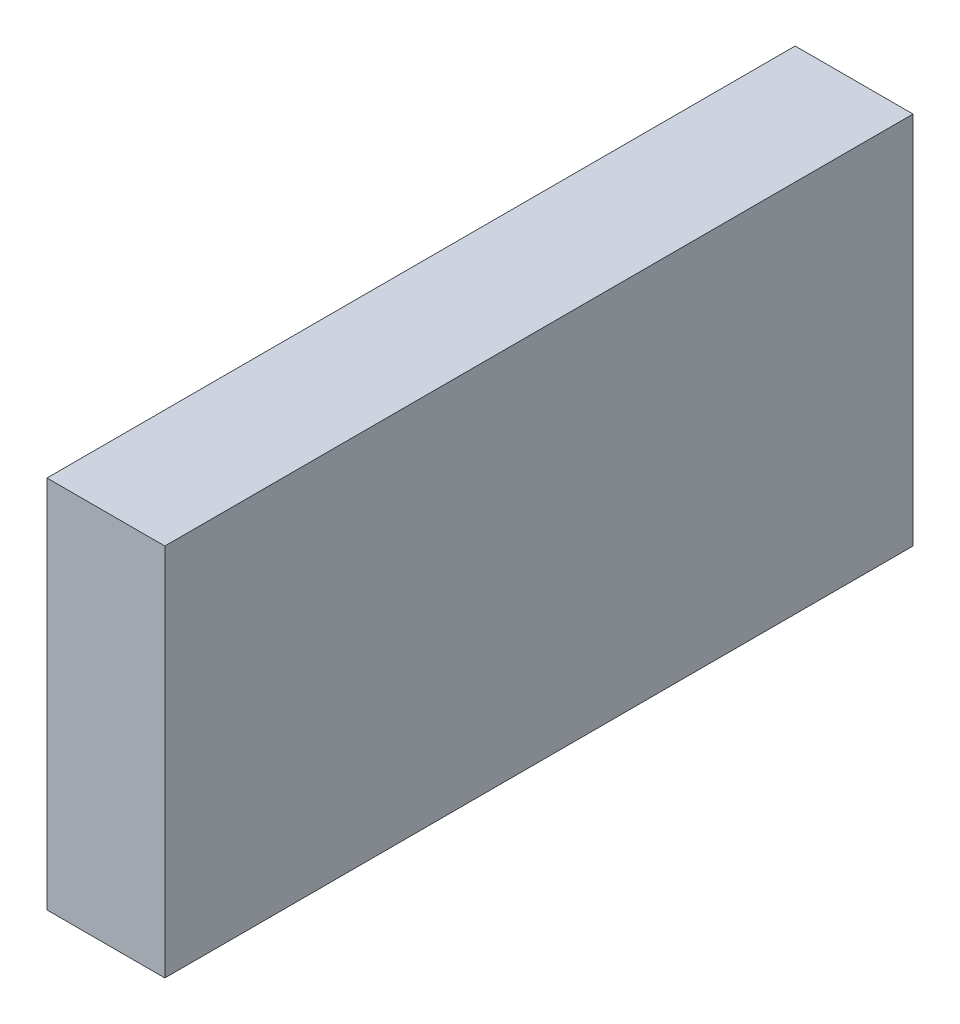
ISO-10303-21;
HEADER;
FILE_DESCRIPTION(('STEP AP214'),'2;1');
FILE_NAME('part.step','',(''),(''),'','','');
FILE_SCHEMA(('AUTOMOTIVE_DESIGN { 1 0 10303 214 1 1 1 1 }'));
ENDSEC;
DATA;
#1=APPLICATION_CONTEXT('core data for automotive mechanical design processes');
#2=APPLICATION_PROTOCOL_DEFINITION('international standard','automotive_design',2000,#1);
#3=PRODUCT_CONTEXT('',#1,'mechanical');
#4=PRODUCT('Part','Part','',(#3));
#5=PRODUCT_RELATED_PRODUCT_CATEGORY('part','',(#4));
#6=PRODUCT_DEFINITION_FORMATION('','',#4);
#7=PRODUCT_DEFINITION_CONTEXT('part definition',#1,'design');
#8=PRODUCT_DEFINITION('design','',#6,#7);
#9=PRODUCT_DEFINITION_SHAPE('','',#8);
#10=(LENGTH_UNIT() NAMED_UNIT(*) SI_UNIT(.MILLI.,.METRE.));
#11=(NAMED_UNIT(*) PLANE_ANGLE_UNIT() SI_UNIT($,.RADIAN.));
#12=(NAMED_UNIT(*) SI_UNIT($,.STERADIAN.) SOLID_ANGLE_UNIT());
#13=UNCERTAINTY_MEASURE_WITH_UNIT(LENGTH_MEASURE(1.E-05),#10,'distance_accuracy_value','');
#14=(GEOMETRIC_REPRESENTATION_CONTEXT(3) GLOBAL_UNCERTAINTY_ASSIGNED_CONTEXT((#13)) GLOBAL_UNIT_ASSIGNED_CONTEXT((#10,
#11,#12)) REPRESENTATION_CONTEXT('',''));
#15=CARTESIAN_POINT('',(0.,0.,0.));
#16=DIRECTION('',(0.,0.,1.));
#17=DIRECTION('',(1.,0.,0.));
#18=AXIS2_PLACEMENT_3D('',#15,#16,#17);
#19=CARTESIAN_POINT('',(-6.3,0.,0.));
#20=DIRECTION('',(0.,0.,1.));
#21=DIRECTION('',(1.,0.,0.));
#22=AXIS2_PLACEMENT_3D('',#19,#20,#21);
#23=PLANE('',#22);
#24=DIRECTION('',(0.,-1.,0.));
#25=VECTOR('',#24,1.);
#26=CARTESIAN_POINT('',(0.,0.,0.));
#27=LINE('',#26,#25);
#28=CARTESIAN_POINT('',(0.,20.,0.));
#29=VERTEX_POINT('',#28);
#30=CARTESIAN_POINT('',(0.,0.,0.));
#31=VERTEX_POINT('',#30);
#32=EDGE_CURVE('E107',#29,#31,#27,.T.);
#33=ORIENTED_EDGE('',*,*,#32,.F.);
#34=DIRECTION('',(1.,0.,0.));
#35=VECTOR('',#34,1.);
#36=CARTESIAN_POINT('',(-6.3,20.,0.));
#37=LINE('',#36,#35);
#38=CARTESIAN_POINT('',(-6.3,20.,0.));
#39=VERTEX_POINT('',#38);
#40=EDGE_CURVE('E11',#39,#29,#37,.T.);
#41=ORIENTED_EDGE('',*,*,#40,.F.);
#42=DIRECTION('',(0.,-1.,0.));
#43=VECTOR('',#42,1.);
#44=CARTESIAN_POINT('',(-6.3,0.,0.));
#45=LINE('',#44,#43);
#46=CARTESIAN_POINT('',(-6.3,0.,0.));
#47=VERTEX_POINT('',#46);
#48=EDGE_CURVE('E102',#39,#47,#45,.T.);
#49=ORIENTED_EDGE('',*,*,#48,.T.);
#50=DIRECTION('',(1.,0.,0.));
#51=VECTOR('',#50,1.);
#52=CARTESIAN_POINT('',(-6.3,0.,0.));
#53=LINE('',#52,#51);
#54=EDGE_CURVE('E46',#47,#31,#53,.T.);
#55=ORIENTED_EDGE('',*,*,#54,.T.);
#56=EDGE_LOOP('',(#33,#41,#49,#55));
#57=FACE_BOUND('',#56,.T.);
#58=ADVANCED_FACE('F43',(#57),#23,.T.);
#59=CARTESIAN_POINT('',(-6.3,20.,0.));
#60=DIRECTION('',(0.,1.,0.));
#61=DIRECTION('',(0.,0.,1.));
#62=AXIS2_PLACEMENT_3D('',#59,#60,#61);
#63=PLANE('',#62);
#64=DIRECTION('',(0.,0.,1.));
#65=VECTOR('',#64,1.);
#66=CARTESIAN_POINT('',(0.,20.,0.));
#67=LINE('',#66,#65);
#68=CARTESIAN_POINT('',(0.,20.,-40.));
#69=VERTEX_POINT('',#68);
#70=EDGE_CURVE('E104',#69,#29,#67,.T.);
#71=ORIENTED_EDGE('',*,*,#70,.F.);
#72=DIRECTION('',(1.,0.,0.));
#73=VECTOR('',#72,1.);
#74=CARTESIAN_POINT('',(-6.3,20.,-40.));
#75=LINE('',#74,#73);
#76=CARTESIAN_POINT('',(-6.3,20.,-40.));
#77=VERTEX_POINT('',#76);
#78=EDGE_CURVE('E55',#77,#69,#75,.T.);
#79=ORIENTED_EDGE('',*,*,#78,.F.);
#80=DIRECTION('',(0.,0.,1.));
#81=VECTOR('',#80,1.);
#82=CARTESIAN_POINT('',(-6.3,20.,0.));
#83=LINE('',#82,#81);
#84=EDGE_CURVE('E97',#77,#39,#83,.T.);
#85=ORIENTED_EDGE('',*,*,#84,.T.);
#86=ORIENTED_EDGE('',*,*,#40,.T.);
#87=EDGE_LOOP('',(#71,#79,#85,#86));
#88=FACE_BOUND('',#87,.T.);
#89=ADVANCED_FACE('F117',(#88),#63,.T.);
#90=CARTESIAN_POINT('',(-6.3,0.,-40.));
#91=DIRECTION('',(0.,0.,-1.));
#92=DIRECTION('',(-1.,0.,0.));
#93=AXIS2_PLACEMENT_3D('',#90,#91,#92);
#94=PLANE('',#93);
#95=DIRECTION('',(0.,1.,0.));
#96=VECTOR('',#95,1.);
#97=CARTESIAN_POINT('',(0.,0.,-40.));
#98=LINE('',#97,#96);
#99=CARTESIAN_POINT('',(0.,0.,-40.));
#100=VERTEX_POINT('',#99);
#101=EDGE_CURVE('E93',#100,#69,#98,.T.);
#102=ORIENTED_EDGE('',*,*,#101,.F.);
#103=DIRECTION('',(1.,0.,0.));
#104=VECTOR('',#103,1.);
#105=CARTESIAN_POINT('',(-6.3,0.,-40.));
#106=LINE('',#105,#104);
#107=CARTESIAN_POINT('',(-6.3,0.,-40.));
#108=VERTEX_POINT('',#107);
#109=EDGE_CURVE('E88',#108,#100,#106,.T.);
#110=ORIENTED_EDGE('',*,*,#109,.F.);
#111=DIRECTION('',(0.,1.,0.));
#112=VECTOR('',#111,1.);
#113=CARTESIAN_POINT('',(-6.3,0.,-40.));
#114=LINE('',#113,#112);
#115=EDGE_CURVE('E91',#108,#77,#114,.T.);
#116=ORIENTED_EDGE('',*,*,#115,.T.);
#117=ORIENTED_EDGE('',*,*,#78,.T.);
#118=EDGE_LOOP('',(#102,#110,#116,#117));
#119=FACE_BOUND('',#118,.T.);
#120=ADVANCED_FACE('F89',(#119),#94,.T.);
#121=CARTESIAN_POINT('',(-6.3,0.,0.));
#122=DIRECTION('',(0.,-1.,0.));
#123=DIRECTION('',(0.,0.,-1.));
#124=AXIS2_PLACEMENT_3D('',#121,#122,#123);
#125=PLANE('',#124);
#126=DIRECTION('',(0.,0.,-1.));
#127=VECTOR('',#126,1.);
#128=CARTESIAN_POINT('',(0.,0.,0.));
#129=LINE('',#128,#127);
#130=EDGE_CURVE('E110',#31,#100,#129,.T.);
#131=ORIENTED_EDGE('',*,*,#130,.F.);
#132=ORIENTED_EDGE('',*,*,#54,.F.);
#133=DIRECTION('',(0.,0.,-1.));
#134=VECTOR('',#133,1.);
#135=CARTESIAN_POINT('',(-6.3,0.,0.));
#136=LINE('',#135,#134);
#137=EDGE_CURVE('E100',#47,#108,#136,.T.);
#138=ORIENTED_EDGE('',*,*,#137,.T.);
#139=ORIENTED_EDGE('',*,*,#109,.T.);
#140=EDGE_LOOP('',(#131,#132,#138,#139));
#141=FACE_BOUND('',#140,.T.);
#142=ADVANCED_FACE('F99',(#141),#125,.T.);
#143=CARTESIAN_POINT('',(-6.3,0.,0.));
#144=DIRECTION('',(-1.,0.,0.));
#145=DIRECTION('',(0.,0.,1.));
#146=AXIS2_PLACEMENT_3D('',#143,#144,#145);
#147=PLANE('',#146);
#148=ORIENTED_EDGE('',*,*,#48,.F.);
#149=ORIENTED_EDGE('',*,*,#84,.F.);
#150=ORIENTED_EDGE('',*,*,#115,.F.);
#151=ORIENTED_EDGE('',*,*,#137,.F.);
#152=EDGE_LOOP('',(#148,#149,#150,#151));
#153=FACE_BOUND('',#152,.T.);
#154=ADVANCED_FACE('F96',(#153),#147,.T.);
#155=CARTESIAN_POINT('',(0.,0.,0.));
#156=DIRECTION('',(-1.,0.,0.));
#157=DIRECTION('',(0.,0.,1.));
#158=AXIS2_PLACEMENT_3D('',#155,#156,#157);
#159=PLANE('',#158);
#160=ORIENTED_EDGE('',*,*,#32,.T.);
#161=ORIENTED_EDGE('',*,*,#130,.T.);
#162=ORIENTED_EDGE('',*,*,#101,.T.);
#163=ORIENTED_EDGE('',*,*,#70,.T.);
#164=EDGE_LOOP('',(#160,#161,#162,#163));
#165=FACE_BOUND('',#164,.T.);
#166=ADVANCED_FACE('F116',(#165),#159,.F.);
#167=CLOSED_SHELL('',(#58,#89,#120,#142,#154,#166));
#168=MANIFOLD_SOLID_BREP('B2',#167);
#169=ADVANCED_BREP_SHAPE_REPRESENTATION('',(#18,#168),#14);
#170=SHAPE_DEFINITION_REPRESENTATION(#9,#169);
ENDSEC;
END-ISO-10303-21;
